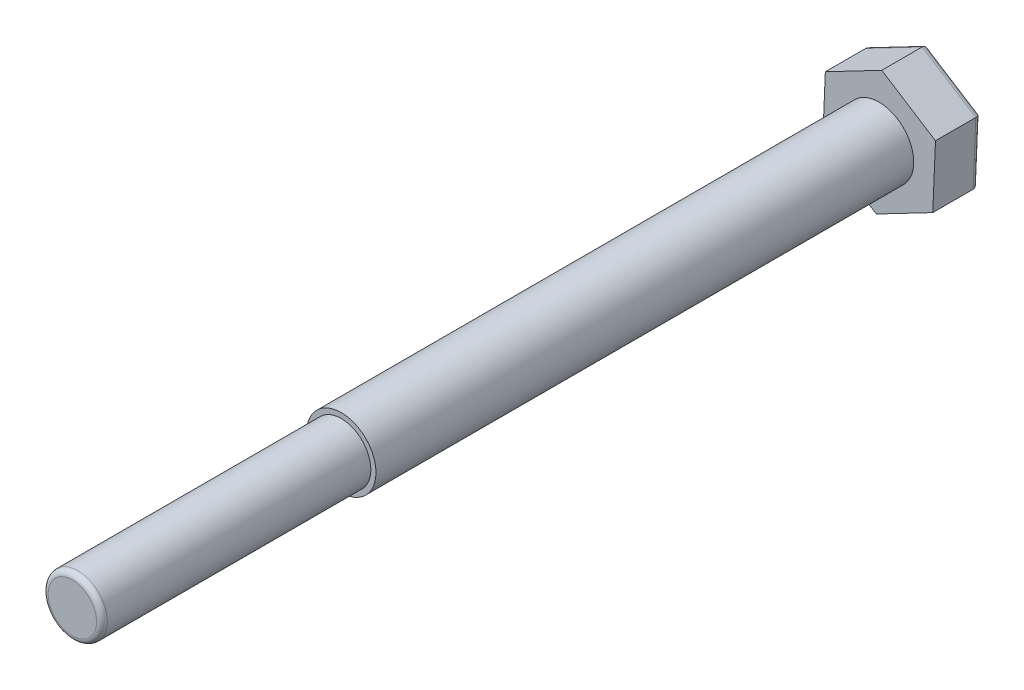
ISO-10303-21;
HEADER;
FILE_DESCRIPTION(('STEP AP214'),'2;1');
FILE_NAME('part.step','',(''),(''),'','','');
FILE_SCHEMA(('AUTOMOTIVE_DESIGN { 1 0 10303 214 1 1 1 1 }'));
ENDSEC;
DATA;
#1=APPLICATION_CONTEXT('core data for automotive mechanical design processes');
#2=APPLICATION_PROTOCOL_DEFINITION('international standard','automotive_design',2000,#1);
#3=PRODUCT_CONTEXT('',#1,'mechanical');
#4=PRODUCT('Part','Part','',(#3));
#5=PRODUCT_RELATED_PRODUCT_CATEGORY('part','',(#4));
#6=PRODUCT_DEFINITION_FORMATION('','',#4);
#7=PRODUCT_DEFINITION_CONTEXT('part definition',#1,'design');
#8=PRODUCT_DEFINITION('design','',#6,#7);
#9=PRODUCT_DEFINITION_SHAPE('','',#8);
#10=(LENGTH_UNIT() NAMED_UNIT(*) SI_UNIT(.MILLI.,.METRE.));
#11=(NAMED_UNIT(*) PLANE_ANGLE_UNIT() SI_UNIT($,.RADIAN.));
#12=(NAMED_UNIT(*) SI_UNIT($,.STERADIAN.) SOLID_ANGLE_UNIT());
#13=UNCERTAINTY_MEASURE_WITH_UNIT(LENGTH_MEASURE(1.E-05),#10,'distance_accuracy_value','');
#14=(GEOMETRIC_REPRESENTATION_CONTEXT(3) GLOBAL_UNCERTAINTY_ASSIGNED_CONTEXT((#13)) GLOBAL_UNIT_ASSIGNED_CONTEXT((#10,
#11,#12)) REPRESENTATION_CONTEXT('',''));
#15=CARTESIAN_POINT('',(0.,0.,0.));
#16=DIRECTION('',(0.,0.,1.));
#17=DIRECTION('',(1.,0.,0.));
#18=AXIS2_PLACEMENT_3D('',#15,#16,#17);
#19=CARTESIAN_POINT('',(0.,0.,217.));
#20=DIRECTION('',(0.,0.,1.));
#21=DIRECTION('',(1.,0.,0.));
#22=AXIS2_PLACEMENT_3D('',#19,#20,#21);
#23=PLANE('',#22);
#24=CARTESIAN_POINT('',(0.,0.,217.));
#25=DIRECTION('',(0.,0.,1.));
#26=DIRECTION('',(1.,0.,0.));
#27=AXIS2_PLACEMENT_3D('',#24,#25,#26);
#28=CIRCLE('',#27,12.9);
#29=CARTESIAN_POINT('',(12.9,0.,217.));
#30=VERTEX_POINT('',#29);
#31=EDGE_CURVE('E130',#30,#30,#28,.T.);
#32=ORIENTED_EDGE('',*,*,#31,.T.);
#33=EDGE_LOOP('',(#32));
#34=FACE_BOUND('',#33,.T.);
#35=CARTESIAN_POINT('',(0.,0.,217.));
#36=DIRECTION('',(0.,0.,1.));
#37=DIRECTION('',(1.,0.,0.));
#38=AXIS2_PLACEMENT_3D('',#35,#36,#37);
#39=CIRCLE('',#38,11.);
#40=CARTESIAN_POINT('',(11.,0.,217.));
#41=VERTEX_POINT('',#40);
#42=EDGE_CURVE('E168',#41,#41,#39,.T.);
#43=ORIENTED_EDGE('',*,*,#42,.F.);
#44=EDGE_LOOP('',(#43));
#45=FACE_BOUND('',#44,.T.);
#46=ADVANCED_FACE('F36',(#34,#45),#23,.T.);
#47=CARTESIAN_POINT('',(18.9733976863162,-36.3457037383633,17.));
#48=DIRECTION('',(0.,0.,-1.));
#49=DIRECTION('',(-1.,0.,0.));
#50=AXIS2_PLACEMENT_3D('',#47,#48,#49);
#51=PLANE('',#50);
#52=DIRECTION('',(0.0424733530909036,0.999097599975706,0.));
#53=VECTOR('',#52,1.);
#54=CARTESIAN_POINT('',(19.9787997617734,-12.6957037383635,17.));
#55=LINE('',#54,#53);
#56=CARTESIAN_POINT('',(19.9787997617734,-12.6957037383635,17.));
#57=VERTEX_POINT('',#56);
#58=CARTESIAN_POINT('',(20.9842018372306,10.9542962616365,17.));
#59=VERTEX_POINT('',#58);
#60=EDGE_CURVE('E122',#57,#59,#55,.T.);
#61=ORIENTED_EDGE('',*,*,#60,.T.);
#62=DIRECTION('',(-0.844007225893572,0.536331802748482,0.));
#63=VECTOR('',#62,1.);
#64=CARTESIAN_POINT('',(20.9842018372306,10.9542962616365,17.));
#65=LINE('',#64,#63);
#66=CARTESIAN_POINT('',(1.0054020754572,23.65,17.));
#67=VERTEX_POINT('',#66);
#68=EDGE_CURVE('E110',#59,#67,#65,.T.);
#69=ORIENTED_EDGE('',*,*,#68,.T.);
#70=DIRECTION('',(-0.886480578984472,-0.462765797227231,0.));
#71=VECTOR('',#70,1.);
#72=CARTESIAN_POINT('',(1.0054020754572,23.65,17.));
#73=LINE('',#72,#71);
#74=CARTESIAN_POINT('',(-19.9787997617736,12.6957037383632,17.));
#75=VERTEX_POINT('',#74);
#76=EDGE_CURVE('E121',#67,#75,#73,.T.);
#77=ORIENTED_EDGE('',*,*,#76,.T.);
#78=DIRECTION('',(-0.0424733530908878,-0.999097599975706,0.));
#79=VECTOR('',#78,1.);
#80=CARTESIAN_POINT('',(-19.9787997617736,12.6957037383632,17.));
#81=LINE('',#80,#79);
#82=CARTESIAN_POINT('',(-20.9842018372304,-10.9542962616368,17.));
#83=VERTEX_POINT('',#82);
#84=EDGE_CURVE('E272',#75,#83,#81,.T.);
#85=ORIENTED_EDGE('',*,*,#84,.T.);
#86=DIRECTION('',(0.844007225893576,-0.536331802748476,0.));
#87=VECTOR('',#86,1.);
#88=CARTESIAN_POINT('',(-20.9842018372304,-10.9542962616368,17.));
#89=LINE('',#88,#87);
#90=CARTESIAN_POINT('',(-1.00540207545719,-23.65,17.));
#91=VERTEX_POINT('',#90);
#92=EDGE_CURVE('E274',#83,#91,#89,.T.);
#93=ORIENTED_EDGE('',*,*,#92,.T.);
#94=DIRECTION('',(0.886480578984476,0.462765797227224,0.));
#95=VECTOR('',#94,1.);
#96=CARTESIAN_POINT('',(-1.00540207545719,-23.65,17.));
#97=LINE('',#96,#95);
#98=EDGE_CURVE('E128',#91,#57,#97,.T.);
#99=ORIENTED_EDGE('',*,*,#98,.T.);
#100=EDGE_LOOP('',(#61,#69,#77,#85,#93,#99));
#101=FACE_BOUND('',#100,.T.);
#102=CARTESIAN_POINT('',(0.,0.,17.));
#103=DIRECTION('',(0.,0.,-1.));
#104=DIRECTION('',(-1.,0.,0.));
#105=AXIS2_PLACEMENT_3D('',#102,#103,#104);
#106=CIRCLE('',#105,12.9);
#107=CARTESIAN_POINT('',(-12.9,0.,17.));
#108=VERTEX_POINT('',#107);
#109=EDGE_CURVE('E135',#108,#108,#106,.F.);
#110=ORIENTED_EDGE('',*,*,#109,.F.);
#111=EDGE_LOOP('',(#110));
#112=FACE_BOUND('',#111,.T.);
#113=ADVANCED_FACE('F125',(#101,#112),#51,.F.);
#114=CARTESIAN_POINT('',(19.9787997617734,-12.6957037383635,17.));
#115=DIRECTION('',(-0.999097599975706,0.0424733530909036,0.));
#116=DIRECTION('',(-0.0424733530909036,-0.999097599975706,0.));
#117=AXIS2_PLACEMENT_3D('',#114,#115,#116);
#118=PLANE('',#117);
#119=DIRECTION('',(0.,0.,-1.));
#120=VECTOR('',#119,1.);
#121=CARTESIAN_POINT('',(19.9787997617734,-12.6957037383635,17.));
#122=LINE('',#121,#120);
#123=CARTESIAN_POINT('',(19.9787997617734,-12.6957037383635,2.));
#124=VERTEX_POINT('',#123);
#125=EDGE_CURVE('E279',#57,#124,#122,.T.);
#126=ORIENTED_EDGE('',*,*,#125,.T.);
#127=DIRECTION('',(0.0424733530909036,0.999097599975706,0.));
#128=VECTOR('',#127,1.);
#129=CARTESIAN_POINT('',(20.9842018372306,10.9542962616365,2.));
#130=LINE('',#129,#128);
#131=CARTESIAN_POINT('',(20.9842018372306,10.9542962616365,2.));
#132=VERTEX_POINT('',#131);
#133=EDGE_CURVE('E134',#124,#132,#130,.T.);
#134=ORIENTED_EDGE('',*,*,#133,.T.);
#135=DIRECTION('',(0.,0.,-1.));
#136=VECTOR('',#135,1.);
#137=CARTESIAN_POINT('',(20.9842018372306,10.9542962616365,17.));
#138=LINE('',#137,#136);
#139=EDGE_CURVE('E115',#59,#132,#138,.T.);
#140=ORIENTED_EDGE('',*,*,#139,.F.);
#141=ORIENTED_EDGE('',*,*,#60,.F.);
#142=EDGE_LOOP('',(#126,#134,#140,#141));
#143=FACE_BOUND('',#142,.T.);
#144=ADVANCED_FACE('F132',(#143),#118,.F.);
#145=CARTESIAN_POINT('',(20.9842018372306,10.9542962616365,17.));
#146=DIRECTION('',(-0.536331802748482,-0.844007225893572,0.));
#147=DIRECTION('',(0.844007225893572,-0.536331802748482,0.));
#148=AXIS2_PLACEMENT_3D('',#145,#146,#147);
#149=PLANE('',#148);
#150=ORIENTED_EDGE('',*,*,#139,.T.);
#151=DIRECTION('',(-0.844007225893572,0.536331802748482,0.));
#152=VECTOR('',#151,1.);
#153=CARTESIAN_POINT('',(1.00540207545719,23.65,2.));
#154=LINE('',#153,#152);
#155=CARTESIAN_POINT('',(1.0054020754572,23.65,2.));
#156=VERTEX_POINT('',#155);
#157=EDGE_CURVE('E138',#132,#156,#154,.T.);
#158=ORIENTED_EDGE('',*,*,#157,.T.);
#159=DIRECTION('',(0.,0.,-1.));
#160=VECTOR('',#159,1.);
#161=CARTESIAN_POINT('',(1.0054020754572,23.65,17.));
#162=LINE('',#161,#160);
#163=EDGE_CURVE('E118',#67,#156,#162,.T.);
#164=ORIENTED_EDGE('',*,*,#163,.F.);
#165=ORIENTED_EDGE('',*,*,#68,.F.);
#166=EDGE_LOOP('',(#150,#158,#164,#165));
#167=FACE_BOUND('',#166,.T.);
#168=ADVANCED_FACE('F112',(#167),#149,.F.);
#169=CARTESIAN_POINT('',(1.0054020754572,23.65,17.));
#170=DIRECTION('',(0.462765797227231,-0.886480578984472,0.));
#171=DIRECTION('',(0.886480578984472,0.462765797227231,0.));
#172=AXIS2_PLACEMENT_3D('',#169,#170,#171);
#173=PLANE('',#172);
#174=ORIENTED_EDGE('',*,*,#163,.T.);
#175=DIRECTION('',(-0.886480578984472,-0.462765797227231,0.));
#176=VECTOR('',#175,1.);
#177=CARTESIAN_POINT('',(-19.9787997617736,12.6957037383632,2.));
#178=LINE('',#177,#176);
#179=CARTESIAN_POINT('',(-19.9787997617736,12.6957037383632,2.));
#180=VERTEX_POINT('',#179);
#181=EDGE_CURVE('E158',#156,#180,#178,.T.);
#182=ORIENTED_EDGE('',*,*,#181,.T.);
#183=DIRECTION('',(0.,0.,-1.));
#184=VECTOR('',#183,1.);
#185=CARTESIAN_POINT('',(-19.9787997617736,12.6957037383632,17.));
#186=LINE('',#185,#184);
#187=EDGE_CURVE('E140',#75,#180,#186,.T.);
#188=ORIENTED_EDGE('',*,*,#187,.F.);
#189=ORIENTED_EDGE('',*,*,#76,.F.);
#190=EDGE_LOOP('',(#174,#182,#188,#189));
#191=FACE_BOUND('',#190,.T.);
#192=ADVANCED_FACE('F223',(#191),#173,.F.);
#193=CARTESIAN_POINT('',(-19.9787997617736,12.6957037383632,17.));
#194=DIRECTION('',(0.999097599975706,-0.0424733530908878,0.));
#195=DIRECTION('',(0.0424733530908878,0.999097599975707,0.));
#196=AXIS2_PLACEMENT_3D('',#193,#194,#195);
#197=PLANE('',#196);
#198=ORIENTED_EDGE('',*,*,#187,.T.);
#199=DIRECTION('',(-0.0424733530908878,-0.999097599975707,0.));
#200=VECTOR('',#199,1.);
#201=CARTESIAN_POINT('',(-20.9842018372304,-10.9542962616368,2.));
#202=LINE('',#201,#200);
#203=CARTESIAN_POINT('',(-20.9842018372304,-10.9542962616368,2.));
#204=VERTEX_POINT('',#203);
#205=EDGE_CURVE('E160',#180,#204,#202,.T.);
#206=ORIENTED_EDGE('',*,*,#205,.T.);
#207=DIRECTION('',(0.,0.,-1.));
#208=VECTOR('',#207,1.);
#209=CARTESIAN_POINT('',(-20.9842018372304,-10.9542962616368,17.));
#210=LINE('',#209,#208);
#211=EDGE_CURVE('E283',#83,#204,#210,.T.);
#212=ORIENTED_EDGE('',*,*,#211,.F.);
#213=ORIENTED_EDGE('',*,*,#84,.F.);
#214=EDGE_LOOP('',(#198,#206,#212,#213));
#215=FACE_BOUND('',#214,.T.);
#216=ADVANCED_FACE('F220',(#215),#197,.F.);
#217=CARTESIAN_POINT('',(-20.9842018372304,-10.9542962616368,17.));
#218=DIRECTION('',(0.536331802748476,0.844007225893576,0.));
#219=DIRECTION('',(-0.844007225893576,0.536331802748476,0.));
#220=AXIS2_PLACEMENT_3D('',#217,#218,#219);
#221=PLANE('',#220);
#222=ORIENTED_EDGE('',*,*,#211,.T.);
#223=DIRECTION('',(0.844007225893576,-0.536331802748476,0.));
#224=VECTOR('',#223,1.);
#225=CARTESIAN_POINT('',(-1.00540207545719,-23.65,2.));
#226=LINE('',#225,#224);
#227=CARTESIAN_POINT('',(-1.00540207545719,-23.65,2.));
#228=VERTEX_POINT('',#227);
#229=EDGE_CURVE('E59',#204,#228,#226,.T.);
#230=ORIENTED_EDGE('',*,*,#229,.T.);
#231=DIRECTION('',(0.,0.,-1.));
#232=VECTOR('',#231,1.);
#233=CARTESIAN_POINT('',(-1.00540207545719,-23.65,17.));
#234=LINE('',#233,#232);
#235=EDGE_CURVE('E281',#91,#228,#234,.T.);
#236=ORIENTED_EDGE('',*,*,#235,.F.);
#237=ORIENTED_EDGE('',*,*,#92,.F.);
#238=EDGE_LOOP('',(#222,#230,#236,#237));
#239=FACE_BOUND('',#238,.T.);
#240=ADVANCED_FACE('F217',(#239),#221,.F.);
#241=CARTESIAN_POINT('',(-1.00540207545719,-23.65,17.));
#242=DIRECTION('',(-0.462765797227224,0.886480578984476,0.));
#243=DIRECTION('',(-0.886480578984476,-0.462765797227224,0.));
#244=AXIS2_PLACEMENT_3D('',#241,#242,#243);
#245=PLANE('',#244);
#246=ORIENTED_EDGE('',*,*,#235,.T.);
#247=DIRECTION('',(0.886480578984476,0.462765797227224,0.));
#248=VECTOR('',#247,1.);
#249=CARTESIAN_POINT('',(19.9787997617734,-12.6957037383635,2.));
#250=LINE('',#249,#248);
#251=EDGE_CURVE('E51',#228,#124,#250,.T.);
#252=ORIENTED_EDGE('',*,*,#251,.T.);
#253=ORIENTED_EDGE('',*,*,#125,.F.);
#254=ORIENTED_EDGE('',*,*,#98,.F.);
#255=EDGE_LOOP('',(#246,#252,#253,#254));
#256=FACE_BOUND('',#255,.T.);
#257=ADVANCED_FACE('F213',(#256),#245,.F.);
#258=CARTESIAN_POINT('',(18.9733976863162,-36.3457037383633,0.));
#259=DIRECTION('',(0.,0.,-1.));
#260=DIRECTION('',(-1.,0.,0.));
#261=AXIS2_PLACEMENT_3D('',#258,#259,#260);
#262=PLANE('',#261);
#263=DIRECTION('',(-0.886480578984472,-0.462765797227231,0.));
#264=VECTOR('',#263,1.);
#265=CARTESIAN_POINT('',(1.93093366991166,21.8770388420311,0.));
#266=LINE('',#265,#264);
#267=CARTESIAN_POINT('',(-18.029648565503,11.4570984955961,0.));
#268=VERTEX_POINT('',#267);
#269=CARTESIAN_POINT('',(0.907314068095531,21.3426829268293,0.));
#270=VERTEX_POINT('',#269);
#271=EDGE_CURVE('E153',#268,#270,#266,.F.);
#272=ORIENTED_EDGE('',*,*,#271,.T.);
#273=DIRECTION('',(-0.844007225893572,0.536331802748482,0.));
#274=VECTOR('',#273,1.);
#275=CARTESIAN_POINT('',(19.9115382317336,9.26628180984933,0.));
#276=LINE('',#275,#274);
#277=CARTESIAN_POINT('',(18.9369626335983,9.88558443123292,0.));
#278=VERTEX_POINT('',#277);
#279=EDGE_CURVE('E155',#270,#278,#276,.F.);
#280=ORIENTED_EDGE('',*,*,#279,.T.);
#281=DIRECTION('',(0.0424733530909036,0.999097599975706,0.));
#282=VECTOR('',#281,1.);
#283=CARTESIAN_POINT('',(17.980604561822,-12.6107570321817,0.));
#284=LINE('',#283,#282);
#285=CARTESIAN_POINT('',(18.0296485655028,-11.4570984955964,0.));
#286=VERTEX_POINT('',#285);
#287=EDGE_CURVE('E145',#278,#286,#284,.F.);
#288=ORIENTED_EDGE('',*,*,#287,.T.);
#289=DIRECTION('',(0.886480578984476,0.462765797227224,0.));
#290=VECTOR('',#289,1.);
#291=CARTESIAN_POINT('',(-1.93093366991164,-21.877038842031,0.));
#292=LINE('',#291,#290);
#293=CARTESIAN_POINT('',(-0.90731406809552,-21.3426829268293,0.));
#294=VERTEX_POINT('',#293);
#295=EDGE_CURVE('E147',#286,#294,#292,.F.);
#296=ORIENTED_EDGE('',*,*,#295,.T.);
#297=DIRECTION('',(0.844007225893576,-0.536331802748476,0.));
#298=VECTOR('',#297,1.);
#299=CARTESIAN_POINT('',(-19.9115382317334,-9.26628180984964,0.));
#300=LINE('',#299,#298);
#301=CARTESIAN_POINT('',(-18.9369626335981,-9.88558443123322,0.));
#302=VERTEX_POINT('',#301);
#303=EDGE_CURVE('E149',#294,#302,#300,.F.);
#304=ORIENTED_EDGE('',*,*,#303,.T.);
#305=DIRECTION('',(-0.0424733530908878,-0.999097599975707,0.));
#306=VECTOR('',#305,1.);
#307=CARTESIAN_POINT('',(-17.9806045618221,12.6107570321814,0.));
#308=LINE('',#307,#306);
#309=EDGE_CURVE('E151',#302,#268,#308,.F.);
#310=ORIENTED_EDGE('',*,*,#309,.T.);
#311=EDGE_LOOP('',(#272,#280,#288,#296,#304,#310));
#312=FACE_BOUND('',#311,.T.);
#313=ADVANCED_FACE('F208',(#312),#262,.T.);
#314=CARTESIAN_POINT('',(0.,0.,217.));
#315=DIRECTION('',(0.,0.,-1.));
#316=DIRECTION('',(-1.,0.,0.));
#317=AXIS2_PLACEMENT_3D('',#314,#315,#316);
#318=CYLINDRICAL_SURFACE('',#317,12.9);
#319=ORIENTED_EDGE('',*,*,#31,.F.);
#320=EDGE_LOOP('',(#319));
#321=FACE_BOUND('',#320,.T.);
#322=ORIENTED_EDGE('',*,*,#109,.T.);
#323=EDGE_LOOP('',(#322));
#324=FACE_BOUND('',#323,.T.);
#325=ADVANCED_FACE('F205',(#321,#324),#318,.T.);
#326=CARTESIAN_POINT('',(-19.9115382317334,-9.26628180984964,2.));
#327=DIRECTION('',(-0.844007225893576,0.536331802748476,0.));
#328=DIRECTION('',(-0.536331802748476,-0.844007225893576,0.));
#329=AXIS2_PLACEMENT_3D('',#326,#327,#328);
#330=CYLINDRICAL_SURFACE('',#329,2.);
#331=CARTESIAN_POINT('',(-18.9369626335981,-9.88558443123322,2.));
#332=DIRECTION('',(-0.462765797227234,0.886480578984471,0.));
#333=DIRECTION('',(-0.886480578984471,-0.462765797227234,0.));
#334=AXIS2_PLACEMENT_3D('',#331,#332,#333);
#335=ELLIPSE('',#334,2.3094010767585,2.);
#336=EDGE_CURVE('E176',#302,#204,#335,.T.);
#337=ORIENTED_EDGE('',*,*,#336,.F.);
#338=ORIENTED_EDGE('',*,*,#303,.F.);
#339=CARTESIAN_POINT('',(-0.90731406809552,-21.3426829268293,2.));
#340=DIRECTION('',(-0.999097599975706,0.0424733530909003,0.));
#341=DIRECTION('',(-0.0424733530909002,-0.999097599975706,0.));
#342=AXIS2_PLACEMENT_3D('',#339,#340,#341);
#343=ELLIPSE('',#342,2.3094010767585,2.);
#344=EDGE_CURVE('E179',#228,#294,#343,.F.);
#345=ORIENTED_EDGE('',*,*,#344,.F.);
#346=ORIENTED_EDGE('',*,*,#229,.F.);
#347=EDGE_LOOP('',(#337,#338,#345,#346));
#348=FACE_BOUND('',#347,.T.);
#349=ADVANCED_FACE('F207',(#348),#330,.T.);
#350=CARTESIAN_POINT('',(-1.93093366991164,-21.877038842031,2.));
#351=DIRECTION('',(-0.886480578984476,-0.462765797227224,0.));
#352=DIRECTION('',(0.462765797227224,-0.886480578984476,0.));
#353=AXIS2_PLACEMENT_3D('',#350,#351,#352);
#354=CYLINDRICAL_SURFACE('',#353,2.);
#355=ORIENTED_EDGE('',*,*,#344,.T.);
#356=ORIENTED_EDGE('',*,*,#295,.F.);
#357=CARTESIAN_POINT('',(18.0296485655028,-11.4570984955964,2.));
#358=DIRECTION('',(-0.536331802748482,-0.844007225893572,0.));
#359=DIRECTION('',(0.844007225893572,-0.536331802748482,0.));
#360=AXIS2_PLACEMENT_3D('',#357,#358,#359);
#361=ELLIPSE('',#360,2.3094010767585,2.);
#362=EDGE_CURVE('E173',#124,#286,#361,.F.);
#363=ORIENTED_EDGE('',*,*,#362,.F.);
#364=ORIENTED_EDGE('',*,*,#251,.F.);
#365=EDGE_LOOP('',(#355,#356,#363,#364));
#366=FACE_BOUND('',#365,.T.);
#367=ADVANCED_FACE('F247',(#366),#354,.T.);
#368=CARTESIAN_POINT('',(-17.9806045618221,12.6107570321814,2.));
#369=DIRECTION('',(0.0424733530908878,0.999097599975707,0.));
#370=DIRECTION('',(-0.999097599975707,0.0424733530908878,0.));
#371=AXIS2_PLACEMENT_3D('',#368,#369,#370);
#372=CYLINDRICAL_SURFACE('',#371,2.);
#373=ORIENTED_EDGE('',*,*,#336,.T.);
#374=ORIENTED_EDGE('',*,*,#205,.F.);
#375=CARTESIAN_POINT('',(-18.029648565503,11.457098495596,2.));
#376=DIRECTION('',(0.536331802748472,0.844007225893579,0.));
#377=DIRECTION('',(-0.844007225893579,0.536331802748472,0.));
#378=AXIS2_PLACEMENT_3D('',#375,#376,#377);
#379=ELLIPSE('',#378,2.30940107675851,2.);
#380=EDGE_CURVE('E170',#268,#180,#379,.T.);
#381=ORIENTED_EDGE('',*,*,#380,.F.);
#382=ORIENTED_EDGE('',*,*,#309,.F.);
#383=EDGE_LOOP('',(#373,#374,#381,#382));
#384=FACE_BOUND('',#383,.T.);
#385=ADVANCED_FACE('F243',(#384),#372,.T.);
#386=CARTESIAN_POINT('',(17.980604561822,-12.6107570321817,2.));
#387=DIRECTION('',(-0.0424733530909036,-0.999097599975706,0.));
#388=DIRECTION('',(0.999097599975706,-0.0424733530909036,0.));
#389=AXIS2_PLACEMENT_3D('',#386,#387,#388);
#390=CYLINDRICAL_SURFACE('',#389,2.);
#391=ORIENTED_EDGE('',*,*,#362,.T.);
#392=ORIENTED_EDGE('',*,*,#287,.F.);
#393=CARTESIAN_POINT('',(18.9369626335983,9.88558443123291,2.));
#394=DIRECTION('',(0.462765797227224,-0.886480578984476,0.));
#395=DIRECTION('',(-0.886480578984476,-0.462765797227224,0.));
#396=AXIS2_PLACEMENT_3D('',#393,#394,#395);
#397=ELLIPSE('',#396,2.3094010767585,2.);
#398=EDGE_CURVE('E167',#132,#278,#397,.F.);
#399=ORIENTED_EDGE('',*,*,#398,.F.);
#400=ORIENTED_EDGE('',*,*,#133,.F.);
#401=EDGE_LOOP('',(#391,#392,#399,#400));
#402=FACE_BOUND('',#401,.T.);
#403=ADVANCED_FACE('F239',(#402),#390,.T.);
#404=CARTESIAN_POINT('',(1.93093366991166,21.8770388420311,2.));
#405=DIRECTION('',(0.886480578984472,0.462765797227231,0.));
#406=DIRECTION('',(-0.462765797227231,0.886480578984472,0.));
#407=AXIS2_PLACEMENT_3D('',#404,#405,#406);
#408=CYLINDRICAL_SURFACE('',#407,2.);
#409=ORIENTED_EDGE('',*,*,#380,.T.);
#410=ORIENTED_EDGE('',*,*,#181,.F.);
#411=CARTESIAN_POINT('',(0.907314068095525,21.3426829268293,2.));
#412=DIRECTION('',(0.999097599975706,-0.0424733530908997,0.));
#413=DIRECTION('',(0.0424733530908995,0.999097599975706,0.));
#414=AXIS2_PLACEMENT_3D('',#411,#412,#413);
#415=ELLIPSE('',#414,2.30940107675851,2.);
#416=EDGE_CURVE('E165',#270,#156,#415,.T.);
#417=ORIENTED_EDGE('',*,*,#416,.F.);
#418=ORIENTED_EDGE('',*,*,#271,.F.);
#419=EDGE_LOOP('',(#409,#410,#417,#418));
#420=FACE_BOUND('',#419,.T.);
#421=ADVANCED_FACE('F235',(#420),#408,.T.);
#422=CARTESIAN_POINT('',(19.9115382317336,9.26628180984933,2.));
#423=DIRECTION('',(0.844007225893572,-0.536331802748482,0.));
#424=DIRECTION('',(0.536331802748482,0.844007225893572,0.));
#425=AXIS2_PLACEMENT_3D('',#422,#423,#424);
#426=CYLINDRICAL_SURFACE('',#425,2.);
#427=ORIENTED_EDGE('',*,*,#398,.T.);
#428=ORIENTED_EDGE('',*,*,#279,.F.);
#429=ORIENTED_EDGE('',*,*,#416,.T.);
#430=ORIENTED_EDGE('',*,*,#157,.F.);
#431=EDGE_LOOP('',(#427,#428,#429,#430));
#432=FACE_BOUND('',#431,.T.);
#433=ADVANCED_FACE('F232',(#432),#426,.T.);
#434=CARTESIAN_POINT('',(0.,0.,317.));
#435=DIRECTION('',(0.,0.,-1.));
#436=DIRECTION('',(-1.,0.,0.));
#437=AXIS2_PLACEMENT_3D('',#434,#435,#436);
#438=CYLINDRICAL_SURFACE('',#437,11.);
#439=CARTESIAN_POINT('',(0.,0.,315.));
#440=DIRECTION('',(0.,0.,1.));
#441=DIRECTION('',(1.,0.,0.));
#442=AXIS2_PLACEMENT_3D('',#439,#440,#441);
#443=CIRCLE('',#442,11.);
#444=CARTESIAN_POINT('',(11.,0.,315.));
#445=VERTEX_POINT('',#444);
#446=EDGE_CURVE('E11',#445,#445,#443,.F.);
#447=ORIENTED_EDGE('',*,*,#446,.T.);
#448=EDGE_LOOP('',(#447));
#449=FACE_BOUND('',#448,.T.);
#450=ORIENTED_EDGE('',*,*,#42,.T.);
#451=EDGE_LOOP('',(#450));
#452=FACE_BOUND('',#451,.T.);
#453=ADVANCED_FACE('F191',(#449,#452),#438,.T.);
#454=CARTESIAN_POINT('',(0.,0.,317.));
#455=DIRECTION('',(0.,0.,1.));
#456=DIRECTION('',(1.,0.,0.));
#457=AXIS2_PLACEMENT_3D('',#454,#455,#456);
#458=PLANE('',#457);
#459=CARTESIAN_POINT('',(0.,0.,317.));
#460=DIRECTION('',(0.,0.,1.));
#461=DIRECTION('',(1.,0.,0.));
#462=AXIS2_PLACEMENT_3D('',#459,#460,#461);
#463=CIRCLE('',#462,9.);
#464=CARTESIAN_POINT('',(9.,0.,317.));
#465=VERTEX_POINT('',#464);
#466=EDGE_CURVE('E44',#465,#465,#463,.T.);
#467=ORIENTED_EDGE('',*,*,#466,.T.);
#468=EDGE_LOOP('',(#467));
#469=FACE_BOUND('',#468,.T.);
#470=ADVANCED_FACE('F184',(#469),#458,.T.);
#471=CARTESIAN_POINT('',(0.,0.,315.));
#472=DIRECTION('',(0.,0.,1.));
#473=DIRECTION('',(1.,0.,0.));
#474=AXIS2_PLACEMENT_3D('',#471,#472,#473);
#475=TOROIDAL_SURFACE('',#474,9.,2.);
#476=ORIENTED_EDGE('',*,*,#446,.F.);
#477=EDGE_LOOP('',(#476));
#478=FACE_BOUND('',#477,.T.);
#479=ORIENTED_EDGE('',*,*,#466,.F.);
#480=EDGE_LOOP('',(#479));
#481=FACE_BOUND('',#480,.T.);
#482=ADVANCED_FACE('F38',(#478,#481),#475,.T.);
#483=CLOSED_SHELL('',(#46,#113,#144,#168,#192,#216,#240,#257,#313,#325,#349,#367,#385,#403,#421,
#433,#453,#470,#482));
#484=MANIFOLD_SOLID_BREP('B2',#483);
#485=ADVANCED_BREP_SHAPE_REPRESENTATION('',(#18,#484),#14);
#486=SHAPE_DEFINITION_REPRESENTATION(#9,#485);
ENDSEC;
END-ISO-10303-21;
